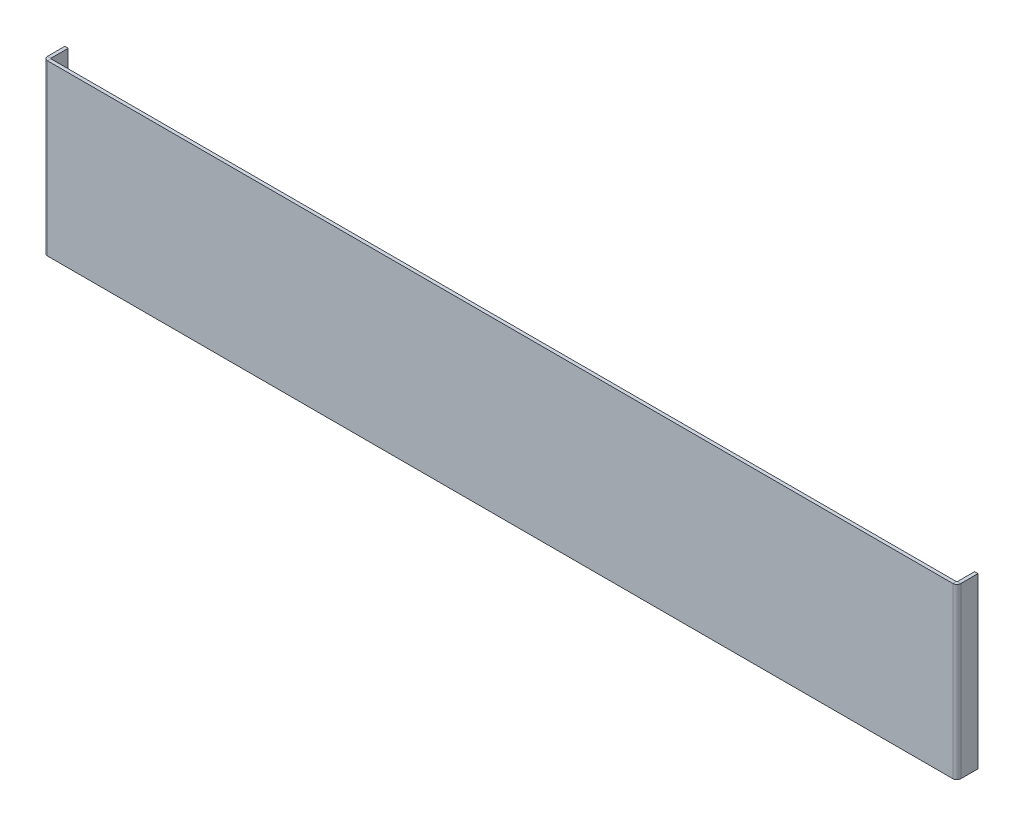
ISO-10303-21;
HEADER;
FILE_DESCRIPTION(('STEP AP214'),'2;1');
FILE_NAME('part.step','',(''),(''),'','','');
FILE_SCHEMA(('AUTOMOTIVE_DESIGN { 1 0 10303 214 1 1 1 1 }'));
ENDSEC;
DATA;
#1=APPLICATION_CONTEXT('core data for automotive mechanical design processes');
#2=APPLICATION_PROTOCOL_DEFINITION('international standard','automotive_design',2000,#1);
#3=PRODUCT_CONTEXT('',#1,'mechanical');
#4=PRODUCT('Part','Part','',(#3));
#5=PRODUCT_RELATED_PRODUCT_CATEGORY('part','',(#4));
#6=PRODUCT_DEFINITION_FORMATION('','',#4);
#7=PRODUCT_DEFINITION_CONTEXT('part definition',#1,'design');
#8=PRODUCT_DEFINITION('design','',#6,#7);
#9=PRODUCT_DEFINITION_SHAPE('','',#8);
#10=(LENGTH_UNIT() NAMED_UNIT(*) SI_UNIT(.MILLI.,.METRE.));
#11=(NAMED_UNIT(*) PLANE_ANGLE_UNIT() SI_UNIT($,.RADIAN.));
#12=(NAMED_UNIT(*) SI_UNIT($,.STERADIAN.) SOLID_ANGLE_UNIT());
#13=UNCERTAINTY_MEASURE_WITH_UNIT(LENGTH_MEASURE(1.E-05),#10,'distance_accuracy_value','');
#14=(GEOMETRIC_REPRESENTATION_CONTEXT(3) GLOBAL_UNCERTAINTY_ASSIGNED_CONTEXT((#13)) GLOBAL_UNIT_ASSIGNED_CONTEXT((#10,
#11,#12)) REPRESENTATION_CONTEXT('',''));
#15=CARTESIAN_POINT('',(0.,0.,0.));
#16=DIRECTION('',(0.,0.,1.));
#17=DIRECTION('',(1.,0.,0.));
#18=AXIS2_PLACEMENT_3D('',#15,#16,#17);
#19=CARTESIAN_POINT('',(0.,-100.,6.));
#20=DIRECTION('',(0.,0.,1.));
#21=DIRECTION('',(1.,0.,0.));
#22=AXIS2_PLACEMENT_3D('',#19,#20,#21);
#23=PLANE('',#22);
#24=DIRECTION('',(1.,0.,0.));
#25=VECTOR('',#24,1.);
#26=CARTESIAN_POINT('',(0.,-100.,6.));
#27=LINE('',#26,#25);
#28=CARTESIAN_POINT('',(-535.250000000007,-100.,5.99999999999999));
#29=VERTEX_POINT('',#28);
#30=CARTESIAN_POINT('',(535.250000000007,-100.,6.));
#31=VERTEX_POINT('',#30);
#32=EDGE_CURVE('E65',#29,#31,#27,.T.);
#33=ORIENTED_EDGE('',*,*,#32,.T.);
#34=DIRECTION('',(0.,-1.,0.));
#35=VECTOR('',#34,1.);
#36=CARTESIAN_POINT('',(535.250000000007,-100.,6.));
#37=LINE('',#36,#35);
#38=CARTESIAN_POINT('',(535.250000000007,100.,6.));
#39=VERTEX_POINT('',#38);
#40=EDGE_CURVE('E73',#31,#39,#37,.F.);
#41=ORIENTED_EDGE('',*,*,#40,.T.);
#42=DIRECTION('',(1.,0.,0.));
#43=VECTOR('',#42,1.);
#44=CARTESIAN_POINT('',(0.,100.,6.));
#45=LINE('',#44,#43);
#46=CARTESIAN_POINT('',(-535.250000000007,100.,5.99999999999999));
#47=VERTEX_POINT('',#46);
#48=EDGE_CURVE('E227',#47,#39,#45,.T.);
#49=ORIENTED_EDGE('',*,*,#48,.F.);
#50=DIRECTION('',(0.,-1.,0.));
#51=VECTOR('',#50,1.);
#52=CARTESIAN_POINT('',(-535.250000000007,-100.,5.99999999999999));
#53=LINE('',#52,#51);
#54=EDGE_CURVE('E193',#29,#47,#53,.F.);
#55=ORIENTED_EDGE('',*,*,#54,.F.);
#56=EDGE_LOOP('',(#33,#41,#49,#55));
#57=FACE_BOUND('',#56,.T.);
#58=ADVANCED_FACE('F57',(#57),#23,.T.);
#59=CARTESIAN_POINT('',(0.,-100.,2.));
#60=DIRECTION('',(0.,0.,1.));
#61=DIRECTION('',(1.,0.,0.));
#62=AXIS2_PLACEMENT_3D('',#59,#60,#61);
#63=PLANE('',#62);
#64=DIRECTION('',(0.,-1.,0.));
#65=VECTOR('',#64,1.);
#66=CARTESIAN_POINT('',(535.250000000007,-100.,2.));
#67=LINE('',#66,#65);
#68=CARTESIAN_POINT('',(535.250000000007,-100.,2.));
#69=VERTEX_POINT('',#68);
#70=CARTESIAN_POINT('',(535.250000000007,100.,2.));
#71=VERTEX_POINT('',#70);
#72=EDGE_CURVE('E257',#69,#71,#67,.F.);
#73=ORIENTED_EDGE('',*,*,#72,.F.);
#74=DIRECTION('',(1.,0.,0.));
#75=VECTOR('',#74,1.);
#76=CARTESIAN_POINT('',(0.,-100.,2.));
#77=LINE('',#76,#75);
#78=CARTESIAN_POINT('',(-535.250000000007,-100.,1.99999999999999));
#79=VERTEX_POINT('',#78);
#80=EDGE_CURVE('E13',#79,#69,#77,.T.);
#81=ORIENTED_EDGE('',*,*,#80,.F.);
#82=DIRECTION('',(0.,-1.,0.));
#83=VECTOR('',#82,1.);
#84=CARTESIAN_POINT('',(-535.250000000007,-100.,1.99999999999999));
#85=LINE('',#84,#83);
#86=CARTESIAN_POINT('',(-535.250000000007,100.,1.99999999999999));
#87=VERTEX_POINT('',#86);
#88=EDGE_CURVE('E200',#79,#87,#85,.F.);
#89=ORIENTED_EDGE('',*,*,#88,.T.);
#90=DIRECTION('',(1.,0.,0.));
#91=VECTOR('',#90,1.);
#92=CARTESIAN_POINT('',(0.,100.,2.));
#93=LINE('',#92,#91);
#94=EDGE_CURVE('E230',#87,#71,#93,.T.);
#95=ORIENTED_EDGE('',*,*,#94,.T.);
#96=EDGE_LOOP('',(#73,#81,#89,#95));
#97=FACE_BOUND('',#96,.T.);
#98=ADVANCED_FACE('F282',(#97),#63,.F.);
#99=CARTESIAN_POINT('',(0.,-100.,0.));
#100=DIRECTION('',(0.,-1.,0.));
#101=DIRECTION('',(-1.,0.,0.));
#102=AXIS2_PLACEMENT_3D('',#99,#100,#101);
#103=PLANE('',#102);
#104=ORIENTED_EDGE('',*,*,#80,.T.);
#105=DIRECTION('',(0.,0.,1.));
#106=VECTOR('',#105,1.);
#107=CARTESIAN_POINT('',(535.250000000007,-100.,2.));
#108=LINE('',#107,#106);
#109=EDGE_CURVE('E254',#69,#31,#108,.T.);
#110=ORIENTED_EDGE('',*,*,#109,.T.);
#111=ORIENTED_EDGE('',*,*,#32,.F.);
#112=DIRECTION('',(0.,0.,1.));
#113=VECTOR('',#112,1.);
#114=CARTESIAN_POINT('',(-535.250000000007,-100.,1.99999999999999));
#115=LINE('',#114,#113);
#116=EDGE_CURVE('E196',#79,#29,#115,.T.);
#117=ORIENTED_EDGE('',*,*,#116,.F.);
#118=EDGE_LOOP('',(#104,#110,#111,#117));
#119=FACE_BOUND('',#118,.T.);
#120=ADVANCED_FACE('F267',(#119),#103,.T.);
#121=CARTESIAN_POINT('',(535.250000000007,-100.,1.24999999999997));
#122=DIRECTION('',(0.,1.,0.));
#123=DIRECTION('',(0.,0.,1.));
#124=AXIS2_PLACEMENT_3D('',#121,#122,#123);
#125=PLANE('',#124);
#126=CARTESIAN_POINT('',(535.250000000007,-100.,1.24999999999997));
#127=DIRECTION('',(0.,-1.,0.));
#128=DIRECTION('',(0.,0.,-1.));
#129=AXIS2_PLACEMENT_3D('',#126,#127,#128);
#130=CIRCLE('',#129,0.750000000000028);
#131=CARTESIAN_POINT('',(536.000000000007,-100.,1.24999999999997));
#132=VERTEX_POINT('',#131);
#133=EDGE_CURVE('E237',#132,#69,#130,.T.);
#134=ORIENTED_EDGE('',*,*,#133,.F.);
#135=DIRECTION('',(-1.,0.,0.));
#136=VECTOR('',#135,1.);
#137=CARTESIAN_POINT('',(536.000000000007,-100.,1.24999999999997));
#138=LINE('',#137,#136);
#139=CARTESIAN_POINT('',(540.000000000007,-100.,1.24999999999999));
#140=VERTEX_POINT('',#139);
#141=EDGE_CURVE('E248',#132,#140,#138,.F.);
#142=ORIENTED_EDGE('',*,*,#141,.T.);
#143=CARTESIAN_POINT('',(535.250000000007,-100.,1.24999999999997));
#144=DIRECTION('',(0.,-1.,0.));
#145=DIRECTION('',(0.,0.,-1.));
#146=AXIS2_PLACEMENT_3D('',#143,#144,#145);
#147=CIRCLE('',#146,4.75000000000003);
#148=EDGE_CURVE('E255',#140,#31,#147,.T.);
#149=ORIENTED_EDGE('',*,*,#148,.T.);
#150=ORIENTED_EDGE('',*,*,#109,.F.);
#151=EDGE_LOOP('',(#134,#142,#149,#150));
#152=FACE_BOUND('',#151,.T.);
#153=ADVANCED_FACE('F318',(#152),#125,.F.);
#154=CARTESIAN_POINT('',(535.250000000007,-100.,1.24999999999997));
#155=DIRECTION('',(0.,-1.,0.));
#156=DIRECTION('',(1.,0.,0.));
#157=AXIS2_PLACEMENT_3D('',#154,#155,#156);
#158=CYLINDRICAL_SURFACE('',#157,4.75000000000003);
#159=ORIENTED_EDGE('',*,*,#40,.F.);
#160=ORIENTED_EDGE('',*,*,#148,.F.);
#161=DIRECTION('',(0.,-1.,0.));
#162=VECTOR('',#161,1.);
#163=CARTESIAN_POINT('',(540.000000000007,0.,1.24999999999999));
#164=LINE('',#163,#162);
#165=CARTESIAN_POINT('',(540.000000000007,100.,1.24999999999999));
#166=VERTEX_POINT('',#165);
#167=EDGE_CURVE('E246',#140,#166,#164,.F.);
#168=ORIENTED_EDGE('',*,*,#167,.T.);
#169=CARTESIAN_POINT('',(535.250000000007,100.,1.24999999999997));
#170=DIRECTION('',(0.,-1.,0.));
#171=DIRECTION('',(0.,0.,-1.));
#172=AXIS2_PLACEMENT_3D('',#169,#170,#171);
#173=CIRCLE('',#172,4.75000000000003);
#174=EDGE_CURVE('E220',#166,#39,#173,.T.);
#175=ORIENTED_EDGE('',*,*,#174,.T.);
#176=EDGE_LOOP('',(#159,#160,#168,#175));
#177=FACE_BOUND('',#176,.T.);
#178=ADVANCED_FACE('F323',(#177),#158,.T.);
#179=CARTESIAN_POINT('',(535.250000000007,-100.,1.24999999999997));
#180=DIRECTION('',(0.,-1.,0.));
#181=DIRECTION('',(1.,0.,0.));
#182=AXIS2_PLACEMENT_3D('',#179,#180,#181);
#183=CYLINDRICAL_SURFACE('',#182,0.750000000000028);
#184=ORIENTED_EDGE('',*,*,#72,.T.);
#185=CARTESIAN_POINT('',(535.250000000007,100.,1.24999999999997));
#186=DIRECTION('',(0.,-1.,0.));
#187=DIRECTION('',(0.,0.,-1.));
#188=AXIS2_PLACEMENT_3D('',#185,#186,#187);
#189=CIRCLE('',#188,0.750000000000028);
#190=CARTESIAN_POINT('',(536.000000000007,100.,1.24999999999997));
#191=VERTEX_POINT('',#190);
#192=EDGE_CURVE('E211',#191,#71,#189,.T.);
#193=ORIENTED_EDGE('',*,*,#192,.F.);
#194=DIRECTION('',(0.,-1.,0.));
#195=VECTOR('',#194,1.);
#196=CARTESIAN_POINT('',(536.000000000007,0.,1.24999999999997));
#197=LINE('',#196,#195);
#198=EDGE_CURVE('E233',#191,#132,#197,.T.);
#199=ORIENTED_EDGE('',*,*,#198,.T.);
#200=ORIENTED_EDGE('',*,*,#133,.T.);
#201=EDGE_LOOP('',(#184,#193,#199,#200));
#202=FACE_BOUND('',#201,.T.);
#203=ADVANCED_FACE('F285',(#202),#183,.F.);
#204=CARTESIAN_POINT('',(540.000000000007,-100.,-19.));
#205=DIRECTION('',(0.,1.,0.));
#206=DIRECTION('',(0.,0.,1.));
#207=AXIS2_PLACEMENT_3D('',#204,#205,#206);
#208=PLANE('',#207);
#209=ORIENTED_EDGE('',*,*,#141,.F.);
#210=DIRECTION('',(0.,0.,1.));
#211=VECTOR('',#210,1.);
#212=CARTESIAN_POINT('',(536.000000000007,-100.,-19.));
#213=LINE('',#212,#211);
#214=CARTESIAN_POINT('',(536.000000000007,-100.,-19.));
#215=VERTEX_POINT('',#214);
#216=EDGE_CURVE('E244',#132,#215,#213,.F.);
#217=ORIENTED_EDGE('',*,*,#216,.T.);
#218=DIRECTION('',(-1.,0.,0.));
#219=VECTOR('',#218,1.);
#220=CARTESIAN_POINT('',(540.000000000007,-100.,-19.));
#221=LINE('',#220,#219);
#222=CARTESIAN_POINT('',(540.000000000007,-100.,-19.));
#223=VERTEX_POINT('',#222);
#224=EDGE_CURVE('E234',#223,#215,#221,.T.);
#225=ORIENTED_EDGE('',*,*,#224,.F.);
#226=DIRECTION('',(0.,0.,-1.));
#227=VECTOR('',#226,1.);
#228=CARTESIAN_POINT('',(540.000000000007,-100.,2.86882513153438E-12));
#229=LINE('',#228,#227);
#230=EDGE_CURVE('E240',#140,#223,#229,.T.);
#231=ORIENTED_EDGE('',*,*,#230,.F.);
#232=EDGE_LOOP('',(#209,#217,#225,#231));
#233=FACE_BOUND('',#232,.T.);
#234=ADVANCED_FACE('F327',(#233),#208,.F.);
#235=CARTESIAN_POINT('',(540.000000000007,0.,2.86882513153438E-12));
#236=DIRECTION('',(-1.,0.,0.));
#237=DIRECTION('',(0.,0.,1.));
#238=AXIS2_PLACEMENT_3D('',#235,#236,#237);
#239=PLANE('',#238);
#240=ORIENTED_EDGE('',*,*,#167,.F.);
#241=ORIENTED_EDGE('',*,*,#230,.T.);
#242=DIRECTION('',(0.,1.,0.));
#243=VECTOR('',#242,1.);
#244=CARTESIAN_POINT('',(540.000000000007,0.,-19.));
#245=LINE('',#244,#243);
#246=CARTESIAN_POINT('',(540.000000000007,100.,-19.));
#247=VERTEX_POINT('',#246);
#248=EDGE_CURVE('E238',#223,#247,#245,.T.);
#249=ORIENTED_EDGE('',*,*,#248,.T.);
#250=DIRECTION('',(0.,0.,-1.));
#251=VECTOR('',#250,1.);
#252=CARTESIAN_POINT('',(540.000000000007,100.,2.86882513153438E-12));
#253=LINE('',#252,#251);
#254=EDGE_CURVE('E212',#166,#247,#253,.T.);
#255=ORIENTED_EDGE('',*,*,#254,.F.);
#256=EDGE_LOOP('',(#240,#241,#249,#255));
#257=FACE_BOUND('',#256,.T.);
#258=ADVANCED_FACE('F332',(#257),#239,.F.);
#259=CARTESIAN_POINT('',(536.000000000007,0.,2.85484635637548E-12));
#260=DIRECTION('',(-1.,0.,0.));
#261=DIRECTION('',(0.,0.,1.));
#262=AXIS2_PLACEMENT_3D('',#259,#260,#261);
#263=PLANE('',#262);
#264=ORIENTED_EDGE('',*,*,#216,.F.);
#265=ORIENTED_EDGE('',*,*,#198,.F.);
#266=DIRECTION('',(0.,0.,1.));
#267=VECTOR('',#266,1.);
#268=CARTESIAN_POINT('',(536.000000000007,100.,-19.));
#269=LINE('',#268,#267);
#270=CARTESIAN_POINT('',(536.000000000007,100.,-19.));
#271=VERTEX_POINT('',#270);
#272=EDGE_CURVE('E215',#191,#271,#269,.F.);
#273=ORIENTED_EDGE('',*,*,#272,.T.);
#274=DIRECTION('',(0.,-1.,0.));
#275=VECTOR('',#274,1.);
#276=CARTESIAN_POINT('',(536.000000000007,0.,-19.));
#277=LINE('',#276,#275);
#278=EDGE_CURVE('E242',#215,#271,#277,.F.);
#279=ORIENTED_EDGE('',*,*,#278,.F.);
#280=EDGE_LOOP('',(#264,#265,#273,#279));
#281=FACE_BOUND('',#280,.T.);
#282=ADVANCED_FACE('F337',(#281),#263,.T.);
#283=CARTESIAN_POINT('',(540.000000000007,0.,-19.));
#284=DIRECTION('',(0.,0.,1.));
#285=DIRECTION('',(1.,0.,0.));
#286=AXIS2_PLACEMENT_3D('',#283,#284,#285);
#287=PLANE('',#286);
#288=ORIENTED_EDGE('',*,*,#278,.T.);
#289=DIRECTION('',(-1.,0.,0.));
#290=VECTOR('',#289,1.);
#291=CARTESIAN_POINT('',(540.000000000007,100.,-19.));
#292=LINE('',#291,#290);
#293=EDGE_CURVE('E208',#247,#271,#292,.T.);
#294=ORIENTED_EDGE('',*,*,#293,.F.);
#295=ORIENTED_EDGE('',*,*,#248,.F.);
#296=ORIENTED_EDGE('',*,*,#224,.T.);
#297=EDGE_LOOP('',(#288,#294,#295,#296));
#298=FACE_BOUND('',#297,.T.);
#299=ADVANCED_FACE('F334',(#298),#287,.F.);
#300=CARTESIAN_POINT('',(0.,100.,0.));
#301=DIRECTION('',(0.,1.,0.));
#302=DIRECTION('',(-1.,0.,0.));
#303=AXIS2_PLACEMENT_3D('',#300,#301,#302);
#304=PLANE('',#303);
#305=ORIENTED_EDGE('',*,*,#94,.F.);
#306=DIRECTION('',(0.,0.,1.));
#307=VECTOR('',#306,1.);
#308=CARTESIAN_POINT('',(-535.250000000007,100.,1.99999999999999));
#309=LINE('',#308,#307);
#310=EDGE_CURVE('E173',#87,#47,#309,.T.);
#311=ORIENTED_EDGE('',*,*,#310,.T.);
#312=ORIENTED_EDGE('',*,*,#48,.T.);
#313=DIRECTION('',(0.,0.,1.));
#314=VECTOR('',#313,1.);
#315=CARTESIAN_POINT('',(535.250000000007,100.,2.));
#316=LINE('',#315,#314);
#317=EDGE_CURVE('E222',#71,#39,#316,.T.);
#318=ORIENTED_EDGE('',*,*,#317,.F.);
#319=EDGE_LOOP('',(#305,#311,#312,#318));
#320=FACE_BOUND('',#319,.T.);
#321=ADVANCED_FACE('F293',(#320),#304,.T.);
#322=CARTESIAN_POINT('',(535.250000000007,100.,1.24999999999997));
#323=DIRECTION('',(0.,-1.,0.));
#324=DIRECTION('',(0.,0.,1.));
#325=AXIS2_PLACEMENT_3D('',#322,#323,#324);
#326=PLANE('',#325);
#327=ORIENTED_EDGE('',*,*,#192,.T.);
#328=ORIENTED_EDGE('',*,*,#317,.T.);
#329=ORIENTED_EDGE('',*,*,#174,.F.);
#330=DIRECTION('',(-1.,0.,0.));
#331=VECTOR('',#330,1.);
#332=CARTESIAN_POINT('',(536.000000000007,100.,1.24999999999997));
#333=LINE('',#332,#331);
#334=EDGE_CURVE('E207',#191,#166,#333,.F.);
#335=ORIENTED_EDGE('',*,*,#334,.F.);
#336=EDGE_LOOP('',(#327,#328,#329,#335));
#337=FACE_BOUND('',#336,.T.);
#338=ADVANCED_FACE('F290',(#337),#326,.F.);
#339=CARTESIAN_POINT('',(540.000000000007,100.,-19.));
#340=DIRECTION('',(0.,-1.,0.));
#341=DIRECTION('',(0.,0.,1.));
#342=AXIS2_PLACEMENT_3D('',#339,#340,#341);
#343=PLANE('',#342);
#344=ORIENTED_EDGE('',*,*,#334,.T.);
#345=ORIENTED_EDGE('',*,*,#254,.T.);
#346=ORIENTED_EDGE('',*,*,#293,.T.);
#347=ORIENTED_EDGE('',*,*,#272,.F.);
#348=EDGE_LOOP('',(#344,#345,#346,#347));
#349=FACE_BOUND('',#348,.T.);
#350=ADVANCED_FACE('F349',(#349),#343,.F.);
#351=CARTESIAN_POINT('',(-535.250000000007,-100.,1.24999999999997));
#352=DIRECTION('',(0.,1.,0.));
#353=DIRECTION('',(0.,0.,1.));
#354=AXIS2_PLACEMENT_3D('',#351,#352,#353);
#355=PLANE('',#354);
#356=CARTESIAN_POINT('',(-535.250000000007,-100.,1.24999999999997));
#357=DIRECTION('',(0.,1.,0.));
#358=DIRECTION('',(0.,0.,-1.));
#359=AXIS2_PLACEMENT_3D('',#356,#357,#358);
#360=CIRCLE('',#359,0.750000000000028);
#361=CARTESIAN_POINT('',(-536.000000000007,-100.,1.24999999999997));
#362=VERTEX_POINT('',#361);
#363=EDGE_CURVE('E179',#362,#79,#360,.T.);
#364=ORIENTED_EDGE('',*,*,#363,.T.);
#365=ORIENTED_EDGE('',*,*,#116,.T.);
#366=CARTESIAN_POINT('',(-535.250000000007,-100.,1.24999999999997));
#367=DIRECTION('',(0.,1.,0.));
#368=DIRECTION('',(0.,0.,-1.));
#369=AXIS2_PLACEMENT_3D('',#366,#367,#368);
#370=CIRCLE('',#369,4.75000000000003);
#371=CARTESIAN_POINT('',(-540.000000000007,-100.,1.24999999999999));
#372=VERTEX_POINT('',#371);
#373=EDGE_CURVE('E197',#372,#29,#370,.T.);
#374=ORIENTED_EDGE('',*,*,#373,.F.);
#375=DIRECTION('',(1.,0.,0.));
#376=VECTOR('',#375,1.);
#377=CARTESIAN_POINT('',(-536.000000000007,-100.,1.24999999999997));
#378=LINE('',#377,#376);
#379=EDGE_CURVE('E188',#362,#372,#378,.F.);
#380=ORIENTED_EDGE('',*,*,#379,.F.);
#381=EDGE_LOOP('',(#364,#365,#374,#380));
#382=FACE_BOUND('',#381,.T.);
#383=ADVANCED_FACE('F274',(#382),#355,.F.);
#384=CARTESIAN_POINT('',(-535.250000000007,-100.,1.24999999999997));
#385=DIRECTION('',(0.,-1.,0.));
#386=DIRECTION('',(-1.,0.,0.));
#387=AXIS2_PLACEMENT_3D('',#384,#385,#386);
#388=CYLINDRICAL_SURFACE('',#387,4.75000000000003);
#389=ORIENTED_EDGE('',*,*,#54,.T.);
#390=CARTESIAN_POINT('',(-535.250000000007,100.,1.24999999999997));
#391=DIRECTION('',(0.,1.,0.));
#392=DIRECTION('',(0.,0.,-1.));
#393=AXIS2_PLACEMENT_3D('',#390,#391,#392);
#394=CIRCLE('',#393,4.75000000000003);
#395=CARTESIAN_POINT('',(-540.000000000007,100.,1.24999999999999));
#396=VERTEX_POINT('',#395);
#397=EDGE_CURVE('E170',#396,#47,#394,.T.);
#398=ORIENTED_EDGE('',*,*,#397,.F.);
#399=DIRECTION('',(0.,-1.,0.));
#400=VECTOR('',#399,1.);
#401=CARTESIAN_POINT('',(-540.000000000007,0.,1.24999999999999));
#402=LINE('',#401,#400);
#403=EDGE_CURVE('E163',#372,#396,#402,.F.);
#404=ORIENTED_EDGE('',*,*,#403,.F.);
#405=ORIENTED_EDGE('',*,*,#373,.T.);
#406=EDGE_LOOP('',(#389,#398,#404,#405));
#407=FACE_BOUND('',#406,.T.);
#408=ADVANCED_FACE('F271',(#407),#388,.T.);
#409=CARTESIAN_POINT('',(-535.250000000007,-100.,1.24999999999997));
#410=DIRECTION('',(0.,-1.,0.));
#411=DIRECTION('',(-1.,0.,0.));
#412=AXIS2_PLACEMENT_3D('',#409,#410,#411);
#413=CYLINDRICAL_SURFACE('',#412,0.750000000000028);
#414=ORIENTED_EDGE('',*,*,#88,.F.);
#415=ORIENTED_EDGE('',*,*,#363,.F.);
#416=DIRECTION('',(0.,-1.,0.));
#417=VECTOR('',#416,1.);
#418=CARTESIAN_POINT('',(-536.000000000007,0.,1.24999999999997));
#419=LINE('',#418,#417);
#420=CARTESIAN_POINT('',(-536.000000000007,100.,1.24999999999997));
#421=VERTEX_POINT('',#420);
#422=EDGE_CURVE('E178',#421,#362,#419,.T.);
#423=ORIENTED_EDGE('',*,*,#422,.F.);
#424=CARTESIAN_POINT('',(-535.250000000007,100.,1.24999999999997));
#425=DIRECTION('',(0.,1.,0.));
#426=DIRECTION('',(0.,0.,-1.));
#427=AXIS2_PLACEMENT_3D('',#424,#425,#426);
#428=CIRCLE('',#427,0.750000000000028);
#429=EDGE_CURVE('E150',#421,#87,#428,.T.);
#430=ORIENTED_EDGE('',*,*,#429,.T.);
#431=EDGE_LOOP('',(#414,#415,#423,#430));
#432=FACE_BOUND('',#431,.T.);
#433=ADVANCED_FACE('F278',(#432),#413,.F.);
#434=CARTESIAN_POINT('',(-540.000000000007,-100.,-19.));
#435=DIRECTION('',(0.,1.,0.));
#436=DIRECTION('',(0.,0.,1.));
#437=AXIS2_PLACEMENT_3D('',#434,#435,#436);
#438=PLANE('',#437);
#439=ORIENTED_EDGE('',*,*,#379,.T.);
#440=DIRECTION('',(0.,0.,-1.));
#441=VECTOR('',#440,1.);
#442=CARTESIAN_POINT('',(-540.000000000007,-100.,2.86535568458243E-12));
#443=LINE('',#442,#441);
#444=CARTESIAN_POINT('',(-540.000000000007,-100.,-19.));
#445=VERTEX_POINT('',#444);
#446=EDGE_CURVE('E159',#372,#445,#443,.T.);
#447=ORIENTED_EDGE('',*,*,#446,.T.);
#448=DIRECTION('',(1.,0.,0.));
#449=VECTOR('',#448,1.);
#450=CARTESIAN_POINT('',(-540.000000000007,-100.,-19.));
#451=LINE('',#450,#449);
#452=CARTESIAN_POINT('',(-536.000000000007,-100.,-19.));
#453=VERTEX_POINT('',#452);
#454=EDGE_CURVE('E156',#445,#453,#451,.T.);
#455=ORIENTED_EDGE('',*,*,#454,.T.);
#456=DIRECTION('',(0.,0.,1.));
#457=VECTOR('',#456,1.);
#458=CARTESIAN_POINT('',(-536.000000000007,-100.,-19.));
#459=LINE('',#458,#457);
#460=EDGE_CURVE('E184',#362,#453,#459,.F.);
#461=ORIENTED_EDGE('',*,*,#460,.F.);
#462=EDGE_LOOP('',(#439,#447,#455,#461));
#463=FACE_BOUND('',#462,.T.);
#464=ADVANCED_FACE('F300',(#463),#438,.F.);
#465=CARTESIAN_POINT('',(-540.000000000007,0.,2.86535568458243E-12));
#466=DIRECTION('',(1.,0.,0.));
#467=DIRECTION('',(0.,0.,1.));
#468=AXIS2_PLACEMENT_3D('',#465,#466,#467);
#469=PLANE('',#468);
#470=ORIENTED_EDGE('',*,*,#403,.T.);
#471=DIRECTION('',(0.,0.,-1.));
#472=VECTOR('',#471,1.);
#473=CARTESIAN_POINT('',(-540.000000000007,100.,2.86535568458243E-12));
#474=LINE('',#473,#472);
#475=CARTESIAN_POINT('',(-540.000000000007,100.,-19.));
#476=VERTEX_POINT('',#475);
#477=EDGE_CURVE('E144',#396,#476,#474,.T.);
#478=ORIENTED_EDGE('',*,*,#477,.T.);
#479=DIRECTION('',(0.,1.,0.));
#480=VECTOR('',#479,1.);
#481=CARTESIAN_POINT('',(-540.000000000007,0.,-19.));
#482=LINE('',#481,#480);
#483=EDGE_CURVE('E153',#445,#476,#482,.T.);
#484=ORIENTED_EDGE('',*,*,#483,.F.);
#485=ORIENTED_EDGE('',*,*,#446,.F.);
#486=EDGE_LOOP('',(#470,#478,#484,#485));
#487=FACE_BOUND('',#486,.T.);
#488=ADVANCED_FACE('F161',(#487),#469,.F.);
#489=CARTESIAN_POINT('',(-536.000000000007,0.,2.85140260903058E-12));
#490=DIRECTION('',(1.,0.,0.));
#491=DIRECTION('',(0.,0.,1.));
#492=AXIS2_PLACEMENT_3D('',#489,#490,#491);
#493=PLANE('',#492);
#494=ORIENTED_EDGE('',*,*,#460,.T.);
#495=DIRECTION('',(0.,-1.,0.));
#496=VECTOR('',#495,1.);
#497=CARTESIAN_POINT('',(-536.000000000007,0.,-19.));
#498=LINE('',#497,#496);
#499=CARTESIAN_POINT('',(-536.000000000007,100.,-19.));
#500=VERTEX_POINT('',#499);
#501=EDGE_CURVE('E182',#453,#500,#498,.F.);
#502=ORIENTED_EDGE('',*,*,#501,.T.);
#503=DIRECTION('',(0.,0.,1.));
#504=VECTOR('',#503,1.);
#505=CARTESIAN_POINT('',(-536.000000000007,100.,-19.));
#506=LINE('',#505,#504);
#507=EDGE_CURVE('E147',#421,#500,#506,.F.);
#508=ORIENTED_EDGE('',*,*,#507,.F.);
#509=ORIENTED_EDGE('',*,*,#422,.T.);
#510=EDGE_LOOP('',(#494,#502,#508,#509));
#511=FACE_BOUND('',#510,.T.);
#512=ADVANCED_FACE('F298',(#511),#493,.T.);
#513=CARTESIAN_POINT('',(-540.000000000007,0.,-19.));
#514=DIRECTION('',(0.,0.,1.));
#515=DIRECTION('',(-1.,0.,0.));
#516=AXIS2_PLACEMENT_3D('',#513,#514,#515);
#517=PLANE('',#516);
#518=ORIENTED_EDGE('',*,*,#501,.F.);
#519=ORIENTED_EDGE('',*,*,#454,.F.);
#520=ORIENTED_EDGE('',*,*,#483,.T.);
#521=DIRECTION('',(1.,0.,0.));
#522=VECTOR('',#521,1.);
#523=CARTESIAN_POINT('',(-540.000000000007,100.,-19.));
#524=LINE('',#523,#522);
#525=EDGE_CURVE('E140',#476,#500,#524,.T.);
#526=ORIENTED_EDGE('',*,*,#525,.T.);
#527=EDGE_LOOP('',(#518,#519,#520,#526));
#528=FACE_BOUND('',#527,.T.);
#529=ADVANCED_FACE('F154',(#528),#517,.F.);
#530=CARTESIAN_POINT('',(-535.250000000007,100.,1.24999999999997));
#531=DIRECTION('',(0.,-1.,0.));
#532=DIRECTION('',(0.,0.,1.));
#533=AXIS2_PLACEMENT_3D('',#530,#531,#532);
#534=PLANE('',#533);
#535=ORIENTED_EDGE('',*,*,#429,.F.);
#536=DIRECTION('',(1.,0.,0.));
#537=VECTOR('',#536,1.);
#538=CARTESIAN_POINT('',(-536.000000000007,100.,1.24999999999997));
#539=LINE('',#538,#537);
#540=EDGE_CURVE('E166',#421,#396,#539,.F.);
#541=ORIENTED_EDGE('',*,*,#540,.T.);
#542=ORIENTED_EDGE('',*,*,#397,.T.);
#543=ORIENTED_EDGE('',*,*,#310,.F.);
#544=EDGE_LOOP('',(#535,#541,#542,#543));
#545=FACE_BOUND('',#544,.T.);
#546=ADVANCED_FACE('F296',(#545),#534,.F.);
#547=CARTESIAN_POINT('',(-540.000000000007,100.,-19.));
#548=DIRECTION('',(0.,-1.,0.));
#549=DIRECTION('',(0.,0.,1.));
#550=AXIS2_PLACEMENT_3D('',#547,#548,#549);
#551=PLANE('',#550);
#552=ORIENTED_EDGE('',*,*,#540,.F.);
#553=ORIENTED_EDGE('',*,*,#507,.T.);
#554=ORIENTED_EDGE('',*,*,#525,.F.);
#555=ORIENTED_EDGE('',*,*,#477,.F.);
#556=EDGE_LOOP('',(#552,#553,#554,#555));
#557=FACE_BOUND('',#556,.T.);
#558=ADVANCED_FACE('F142',(#557),#551,.F.);
#559=CLOSED_SHELL('',(#58,#98,#120,#153,#178,#203,#234,#258,#282,#299,#321,#338,#350,#383,#408,
#433,#464,#488,#512,#529,#546,#558));
#560=MANIFOLD_SOLID_BREP('B2',#559);
#561=ADVANCED_BREP_SHAPE_REPRESENTATION('',(#18,#560),#14);
#562=SHAPE_DEFINITION_REPRESENTATION(#9,#561);
ENDSEC;
END-ISO-10303-21;
